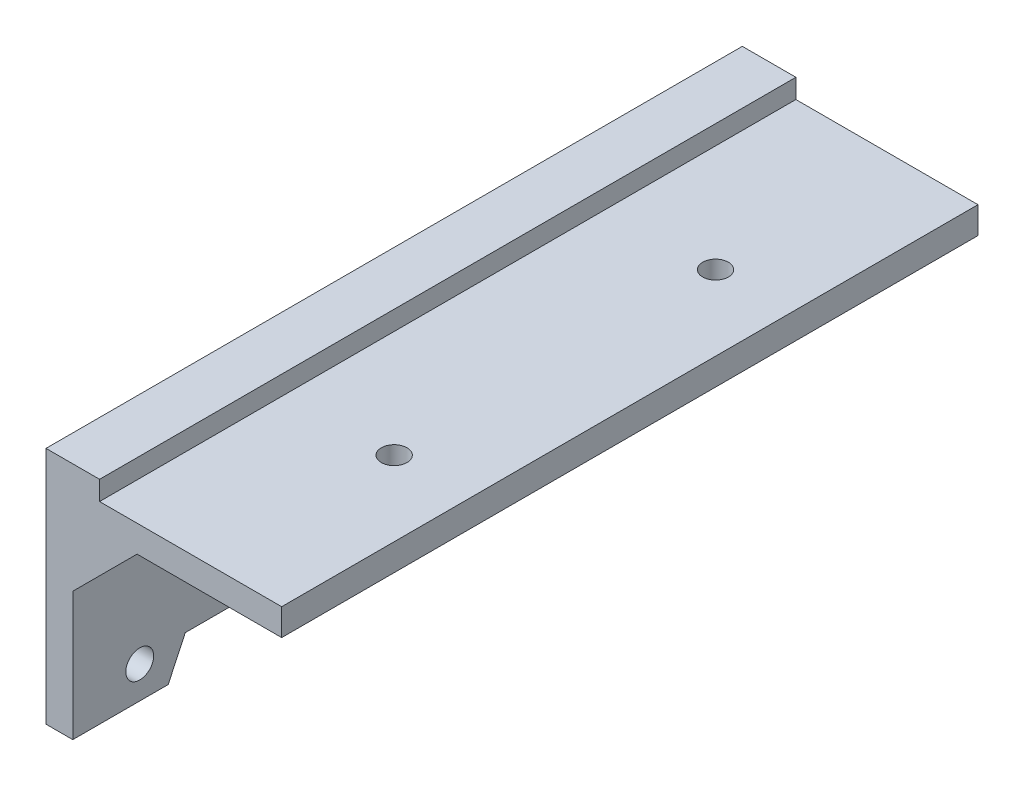
ISO-10303-21;
HEADER;
FILE_DESCRIPTION(('STEP AP214'),'2;1');
FILE_NAME('part.step','',(''),(''),'','','');
FILE_SCHEMA(('AUTOMOTIVE_DESIGN { 1 0 10303 214 1 1 1 1 }'));
ENDSEC;
DATA;
#1=APPLICATION_CONTEXT('core data for automotive mechanical design processes');
#2=APPLICATION_PROTOCOL_DEFINITION('international standard','automotive_design',2000,#1);
#3=PRODUCT_CONTEXT('',#1,'mechanical');
#4=PRODUCT('Part','Part','',(#3));
#5=PRODUCT_RELATED_PRODUCT_CATEGORY('part','',(#4));
#6=PRODUCT_DEFINITION_FORMATION('','',#4);
#7=PRODUCT_DEFINITION_CONTEXT('part definition',#1,'design');
#8=PRODUCT_DEFINITION('design','',#6,#7);
#9=PRODUCT_DEFINITION_SHAPE('','',#8);
#10=(LENGTH_UNIT() NAMED_UNIT(*) SI_UNIT(.MILLI.,.METRE.));
#11=(NAMED_UNIT(*) PLANE_ANGLE_UNIT() SI_UNIT($,.RADIAN.));
#12=(NAMED_UNIT(*) SI_UNIT($,.STERADIAN.) SOLID_ANGLE_UNIT());
#13=UNCERTAINTY_MEASURE_WITH_UNIT(LENGTH_MEASURE(1.E-05),#10,'distance_accuracy_value','');
#14=(GEOMETRIC_REPRESENTATION_CONTEXT(3) GLOBAL_UNCERTAINTY_ASSIGNED_CONTEXT((#13)) GLOBAL_UNIT_ASSIGNED_CONTEXT((#10,
#11,#12)) REPRESENTATION_CONTEXT('',''));
#15=CARTESIAN_POINT('',(0.,0.,0.));
#16=DIRECTION('',(0.,0.,1.));
#17=DIRECTION('',(1.,0.,0.));
#18=AXIS2_PLACEMENT_3D('',#15,#16,#17);
#19=CARTESIAN_POINT('',(1.5875,-13.335,-41.275));
#20=DIRECTION('',(0.,0.,1.));
#21=DIRECTION('',(1.,0.,0.));
#22=AXIS2_PLACEMENT_3D('',#19,#20,#21);
#23=PLANE('',#22);
#24=DIRECTION('',(0.,1.,0.));
#25=VECTOR('',#24,1.);
#26=CARTESIAN_POINT('',(1.5875,-13.335,-41.275));
#27=LINE('',#26,#25);
#28=CARTESIAN_POINT('',(1.5875,-9.525,-41.275));
#29=VERTEX_POINT('',#28);
#30=CARTESIAN_POINT('',(1.5875,5.715,-41.275));
#31=VERTEX_POINT('',#30);
#32=EDGE_CURVE('E45',#29,#31,#27,.T.);
#33=ORIENTED_EDGE('',*,*,#32,.F.);
#34=DIRECTION('',(-1.,0.,0.));
#35=VECTOR('',#34,1.);
#36=CARTESIAN_POINT('',(13.5228846661474,-9.525,-41.275));
#37=LINE('',#36,#35);
#38=CARTESIAN_POINT('',(-1.5875,-9.525,-41.275));
#39=VERTEX_POINT('',#38);
#40=EDGE_CURVE('E176',#29,#39,#37,.T.);
#41=ORIENTED_EDGE('',*,*,#40,.T.);
#42=DIRECTION('',(0.,1.,0.));
#43=VECTOR('',#42,1.);
#44=CARTESIAN_POINT('',(-1.5875,-13.335,-41.275));
#45=LINE('',#44,#43);
#46=CARTESIAN_POINT('',(-1.5875,18.796,-41.275));
#47=VERTEX_POINT('',#46);
#48=EDGE_CURVE('E142',#39,#47,#45,.T.);
#49=ORIENTED_EDGE('',*,*,#48,.T.);
#50=DIRECTION('',(-1.,0.,0.));
#51=VECTOR('',#50,1.);
#52=CARTESIAN_POINT('',(-1.5875,18.796,-41.275));
#53=LINE('',#52,#51);
#54=CARTESIAN_POINT('',(4.7625,18.796,-41.275));
#55=VERTEX_POINT('',#54);
#56=EDGE_CURVE('E155',#55,#47,#53,.T.);
#57=ORIENTED_EDGE('',*,*,#56,.F.);
#58=DIRECTION('',(0.,-1.,0.));
#59=VECTOR('',#58,1.);
#60=CARTESIAN_POINT('',(4.7625,18.796,-41.275));
#61=LINE('',#60,#59);
#62=CARTESIAN_POINT('',(4.7625,16.51,-41.275));
#63=VERTEX_POINT('',#62);
#64=EDGE_CURVE('E160',#55,#63,#61,.T.);
#65=ORIENTED_EDGE('',*,*,#64,.T.);
#66=DIRECTION('',(-1.,0.,0.));
#67=VECTOR('',#66,1.);
#68=CARTESIAN_POINT('',(26.3525,16.51,-41.275));
#69=LINE('',#68,#67);
#70=CARTESIAN_POINT('',(26.3525,16.51,-41.275));
#71=VERTEX_POINT('',#70);
#72=EDGE_CURVE('E244',#71,#63,#69,.T.);
#73=ORIENTED_EDGE('',*,*,#72,.F.);
#74=DIRECTION('',(0.,-1.,0.));
#75=VECTOR('',#74,1.);
#76=CARTESIAN_POINT('',(26.3525,16.51,-41.275));
#77=LINE('',#76,#75);
#78=CARTESIAN_POINT('',(26.3525,13.335,-41.275));
#79=VERTEX_POINT('',#78);
#80=EDGE_CURVE('E230',#71,#79,#77,.T.);
#81=ORIENTED_EDGE('',*,*,#80,.T.);
#82=DIRECTION('',(-1.,0.,0.));
#83=VECTOR('',#82,1.);
#84=CARTESIAN_POINT('',(26.3525,13.335,-41.275));
#85=LINE('',#84,#83);
#86=CARTESIAN_POINT('',(9.2075,13.335,-41.275));
#87=VERTEX_POINT('',#86);
#88=EDGE_CURVE('E241',#79,#87,#85,.T.);
#89=ORIENTED_EDGE('',*,*,#88,.T.);
#90=DIRECTION('',(-0.707106781186547,-0.707106781186548,0.));
#91=VECTOR('',#90,1.);
#92=CARTESIAN_POINT('',(1.5875,5.715,-41.275));
#93=LINE('',#92,#91);
#94=EDGE_CURVE('E187',#87,#31,#93,.T.);
#95=ORIENTED_EDGE('',*,*,#94,.T.);
#96=EDGE_LOOP('',(#33,#41,#49,#57,#65,#73,#81,#89,#95));
#97=FACE_BOUND('',#96,.T.);
#98=ADVANCED_FACE('F37',(#97),#23,.F.);
#99=CARTESIAN_POINT('',(1.5875,-13.335,41.275));
#100=DIRECTION('',(0.,0.,-1.));
#101=DIRECTION('',(-1.,0.,0.));
#102=AXIS2_PLACEMENT_3D('',#99,#100,#101);
#103=PLANE('',#102);
#104=DIRECTION('',(0.,-1.,0.));
#105=VECTOR('',#104,1.);
#106=CARTESIAN_POINT('',(-1.5875,-13.335,41.275));
#107=LINE('',#106,#105);
#108=CARTESIAN_POINT('',(-1.5875,18.796,41.275));
#109=VERTEX_POINT('',#108);
#110=CARTESIAN_POINT('',(-1.5875,-9.525,41.275));
#111=VERTEX_POINT('',#110);
#112=EDGE_CURVE('E40',#109,#111,#107,.T.);
#113=ORIENTED_EDGE('',*,*,#112,.T.);
#114=DIRECTION('',(-1.,0.,0.));
#115=VECTOR('',#114,1.);
#116=CARTESIAN_POINT('',(13.5228846661474,-9.525,41.275));
#117=LINE('',#116,#115);
#118=CARTESIAN_POINT('',(1.5875,-9.525,41.275));
#119=VERTEX_POINT('',#118);
#120=EDGE_CURVE('E170',#119,#111,#117,.T.);
#121=ORIENTED_EDGE('',*,*,#120,.F.);
#122=DIRECTION('',(0.,-1.,0.));
#123=VECTOR('',#122,1.);
#124=CARTESIAN_POINT('',(1.5875,-13.335,41.275));
#125=LINE('',#124,#123);
#126=CARTESIAN_POINT('',(1.5875,5.715,41.275));
#127=VERTEX_POINT('',#126);
#128=EDGE_CURVE('E11',#127,#119,#125,.T.);
#129=ORIENTED_EDGE('',*,*,#128,.F.);
#130=DIRECTION('',(0.707106781186547,0.707106781186548,0.));
#131=VECTOR('',#130,1.);
#132=CARTESIAN_POINT('',(1.5875,5.715,41.275));
#133=LINE('',#132,#131);
#134=CARTESIAN_POINT('',(9.2075,13.335,41.275));
#135=VERTEX_POINT('',#134);
#136=EDGE_CURVE('E175',#127,#135,#133,.T.);
#137=ORIENTED_EDGE('',*,*,#136,.T.);
#138=DIRECTION('',(-1.,0.,0.));
#139=VECTOR('',#138,1.);
#140=CARTESIAN_POINT('',(26.3525,13.335,41.275));
#141=LINE('',#140,#139);
#142=CARTESIAN_POINT('',(26.3525,13.335,41.275));
#143=VERTEX_POINT('',#142);
#144=EDGE_CURVE('E237',#143,#135,#141,.T.);
#145=ORIENTED_EDGE('',*,*,#144,.F.);
#146=DIRECTION('',(0.,1.,0.));
#147=VECTOR('',#146,1.);
#148=CARTESIAN_POINT('',(26.3525,16.51,41.275));
#149=LINE('',#148,#147);
#150=CARTESIAN_POINT('',(26.3525,16.51,41.275));
#151=VERTEX_POINT('',#150);
#152=EDGE_CURVE('E224',#143,#151,#149,.T.);
#153=ORIENTED_EDGE('',*,*,#152,.T.);
#154=DIRECTION('',(-1.,0.,0.));
#155=VECTOR('',#154,1.);
#156=CARTESIAN_POINT('',(26.3525,16.51,41.275));
#157=LINE('',#156,#155);
#158=CARTESIAN_POINT('',(4.76250000000001,16.51,41.275));
#159=VERTEX_POINT('',#158);
#160=EDGE_CURVE('E236',#151,#159,#157,.T.);
#161=ORIENTED_EDGE('',*,*,#160,.T.);
#162=DIRECTION('',(0.,-1.,0.));
#163=VECTOR('',#162,1.);
#164=CARTESIAN_POINT('',(4.76250000000001,18.796,41.275));
#165=LINE('',#164,#163);
#166=CARTESIAN_POINT('',(4.76250000000001,18.796,41.275));
#167=VERTEX_POINT('',#166);
#168=EDGE_CURVE('E147',#167,#159,#165,.T.);
#169=ORIENTED_EDGE('',*,*,#168,.F.);
#170=DIRECTION('',(1.,0.,0.));
#171=VECTOR('',#170,1.);
#172=CARTESIAN_POINT('',(-1.5875,18.796,41.275));
#173=LINE('',#172,#171);
#174=EDGE_CURVE('E144',#109,#167,#173,.T.);
#175=ORIENTED_EDGE('',*,*,#174,.F.);
#176=EDGE_LOOP('',(#113,#121,#129,#137,#145,#153,#161,#169,#175));
#177=FACE_BOUND('',#176,.T.);
#178=ADVANCED_FACE('F145',(#177),#103,.F.);
#179=CARTESIAN_POINT('',(1.5875,0.,0.));
#180=DIRECTION('',(-1.,0.,0.));
#181=DIRECTION('',(0.,0.,1.));
#182=AXIS2_PLACEMENT_3D('',#179,#180,#181);
#183=PLANE('',#182);
#184=ORIENTED_EDGE('',*,*,#128,.T.);
#185=DIRECTION('',(0.,0.,1.));
#186=VECTOR('',#185,1.);
#187=CARTESIAN_POINT('',(1.5875,-9.525,41.275));
#188=LINE('',#187,#186);
#189=CARTESIAN_POINT('',(1.5875,-9.525,29.9640625));
#190=VERTEX_POINT('',#189);
#191=EDGE_CURVE('E165',#190,#119,#188,.T.);
#192=ORIENTED_EDGE('',*,*,#191,.F.);
#193=DIRECTION('',(0.,-0.905458935958869,0.424433876230719));
#194=VECTOR('',#193,1.);
#195=CARTESIAN_POINT('',(1.58750000000001,-5.20699999999999,27.94));
#196=LINE('',#195,#194);
#197=CARTESIAN_POINT('',(1.58750000000001,-5.20699999999999,27.94));
#198=VERTEX_POINT('',#197);
#199=EDGE_CURVE('E195',#198,#190,#196,.T.);
#200=ORIENTED_EDGE('',*,*,#199,.F.);
#201=DIRECTION('',(0.,0.,1.));
#202=VECTOR('',#201,1.);
#203=CARTESIAN_POINT('',(1.58750000000001,-5.207,-27.94));
#204=LINE('',#203,#202);
#205=CARTESIAN_POINT('',(1.58750000000001,-5.207,-27.94));
#206=VERTEX_POINT('',#205);
#207=EDGE_CURVE('E199',#206,#198,#204,.T.);
#208=ORIENTED_EDGE('',*,*,#207,.F.);
#209=DIRECTION('',(0.,0.905458935958869,0.424433876230719));
#210=VECTOR('',#209,1.);
#211=CARTESIAN_POINT('',(1.58750000000001,-13.335,-31.75));
#212=LINE('',#211,#210);
#213=CARTESIAN_POINT('',(1.58750000000001,-9.525,-29.9640625));
#214=VERTEX_POINT('',#213);
#215=EDGE_CURVE('E193',#214,#206,#212,.T.);
#216=ORIENTED_EDGE('',*,*,#215,.F.);
#217=DIRECTION('',(0.,0.,1.));
#218=VECTOR('',#217,1.);
#219=CARTESIAN_POINT('',(1.5875,-9.525,-41.275));
#220=LINE('',#219,#218);
#221=EDGE_CURVE('E173',#29,#214,#220,.T.);
#222=ORIENTED_EDGE('',*,*,#221,.F.);
#223=ORIENTED_EDGE('',*,*,#32,.T.);
#224=DIRECTION('',(0.,0.,1.));
#225=VECTOR('',#224,1.);
#226=CARTESIAN_POINT('',(1.5875,5.715,-52.051307345283));
#227=LINE('',#226,#225);
#228=EDGE_CURVE('E184',#31,#127,#227,.T.);
#229=ORIENTED_EDGE('',*,*,#228,.T.);
#230=EDGE_LOOP('',(#184,#192,#200,#208,#216,#222,#223,#229));
#231=FACE_BOUND('',#230,.T.);
#232=CARTESIAN_POINT('',(1.5875,-5.715,-33.3375));
#233=DIRECTION('',(-1.,0.,0.));
#234=DIRECTION('',(0.,0.,1.));
#235=AXIS2_PLACEMENT_3D('',#232,#233,#234);
#236=CIRCLE('',#235,1.651);
#237=CARTESIAN_POINT('',(1.5875,-5.715,-31.6865));
#238=VERTEX_POINT('',#237);
#239=EDGE_CURVE('E249',#238,#238,#236,.F.);
#240=ORIENTED_EDGE('',*,*,#239,.F.);
#241=EDGE_LOOP('',(#240));
#242=FACE_BOUND('',#241,.T.);
#243=CARTESIAN_POINT('',(1.5875,-5.71499999999999,33.3375));
#244=DIRECTION('',(-1.,0.,0.));
#245=DIRECTION('',(0.,0.,1.));
#246=AXIS2_PLACEMENT_3D('',#243,#244,#245);
#247=CIRCLE('',#246,1.651);
#248=CARTESIAN_POINT('',(1.5875,-5.71499999999999,34.9885));
#249=VERTEX_POINT('',#248);
#250=EDGE_CURVE('E255',#249,#249,#247,.F.);
#251=ORIENTED_EDGE('',*,*,#250,.F.);
#252=EDGE_LOOP('',(#251));
#253=FACE_BOUND('',#252,.T.);
#254=ADVANCED_FACE('F279',(#231,#242,#253),#183,.F.);
#255=CARTESIAN_POINT('',(-1.5875,0.,0.));
#256=DIRECTION('',(-1.,0.,0.));
#257=DIRECTION('',(0.,0.,1.));
#258=AXIS2_PLACEMENT_3D('',#255,#256,#257);
#259=PLANE('',#258);
#260=DIRECTION('',(0.,0.,-1.));
#261=VECTOR('',#260,1.);
#262=CARTESIAN_POINT('',(-1.5875,-9.525,41.275));
#263=LINE('',#262,#261);
#264=CARTESIAN_POINT('',(-1.5875,-9.525,29.9640625));
#265=VERTEX_POINT('',#264);
#266=EDGE_CURVE('E61',#111,#265,#263,.T.);
#267=ORIENTED_EDGE('',*,*,#266,.F.);
#268=ORIENTED_EDGE('',*,*,#112,.F.);
#269=DIRECTION('',(0.,0.,1.));
#270=VECTOR('',#269,1.);
#271=CARTESIAN_POINT('',(-1.5875,18.796,-41.275));
#272=LINE('',#271,#270);
#273=EDGE_CURVE('E138',#47,#109,#272,.T.);
#274=ORIENTED_EDGE('',*,*,#273,.F.);
#275=ORIENTED_EDGE('',*,*,#48,.F.);
#276=DIRECTION('',(0.,0.,-1.));
#277=VECTOR('',#276,1.);
#278=CARTESIAN_POINT('',(-1.5875,-9.525,-41.275));
#279=LINE('',#278,#277);
#280=CARTESIAN_POINT('',(-1.5875,-9.525,-29.9640625));
#281=VERTEX_POINT('',#280);
#282=EDGE_CURVE('E167',#281,#39,#279,.T.);
#283=ORIENTED_EDGE('',*,*,#282,.F.);
#284=DIRECTION('',(0.,-0.905458935958869,-0.424433876230719));
#285=VECTOR('',#284,1.);
#286=CARTESIAN_POINT('',(-1.5875,-13.335,-31.75));
#287=LINE('',#286,#285);
#288=CARTESIAN_POINT('',(-1.5875,-5.207,-27.94));
#289=VERTEX_POINT('',#288);
#290=EDGE_CURVE('E204',#289,#281,#287,.T.);
#291=ORIENTED_EDGE('',*,*,#290,.F.);
#292=DIRECTION('',(0.,0.,-1.));
#293=VECTOR('',#292,1.);
#294=CARTESIAN_POINT('',(-1.5875,-5.207,-27.94));
#295=LINE('',#294,#293);
#296=CARTESIAN_POINT('',(-1.5875,-5.20699999999999,27.94));
#297=VERTEX_POINT('',#296);
#298=EDGE_CURVE('E201',#297,#289,#295,.T.);
#299=ORIENTED_EDGE('',*,*,#298,.F.);
#300=DIRECTION('',(0.,0.905458935958869,-0.424433876230719));
#301=VECTOR('',#300,1.);
#302=CARTESIAN_POINT('',(-1.5875,-5.20699999999999,27.94));
#303=LINE('',#302,#301);
#304=EDGE_CURVE('E192',#265,#297,#303,.T.);
#305=ORIENTED_EDGE('',*,*,#304,.F.);
#306=EDGE_LOOP('',(#267,#268,#274,#275,#283,#291,#299,#305));
#307=FACE_BOUND('',#306,.T.);
#308=CARTESIAN_POINT('',(-1.5875,-5.715,-33.3375));
#309=DIRECTION('',(-1.,0.,0.));
#310=DIRECTION('',(0.,0.,1.));
#311=AXIS2_PLACEMENT_3D('',#308,#309,#310);
#312=CIRCLE('',#311,1.651);
#313=CARTESIAN_POINT('',(-1.5875,-5.715,-31.6865));
#314=VERTEX_POINT('',#313);
#315=EDGE_CURVE('E240',#314,#314,#312,.T.);
#316=ORIENTED_EDGE('',*,*,#315,.F.);
#317=EDGE_LOOP('',(#316));
#318=FACE_BOUND('',#317,.T.);
#319=CARTESIAN_POINT('',(-1.5875,-5.71499999999999,33.3375));
#320=DIRECTION('',(-1.,0.,0.));
#321=DIRECTION('',(0.,0.,1.));
#322=AXIS2_PLACEMENT_3D('',#319,#320,#321);
#323=CIRCLE('',#322,1.651);
#324=CARTESIAN_POINT('',(-1.5875,-5.71499999999999,34.9885));
#325=VERTEX_POINT('',#324);
#326=EDGE_CURVE('E252',#325,#325,#323,.T.);
#327=ORIENTED_EDGE('',*,*,#326,.F.);
#328=EDGE_LOOP('',(#327));
#329=FACE_BOUND('',#328,.T.);
#330=ADVANCED_FACE('F134',(#307,#318,#329),#259,.T.);
#331=CARTESIAN_POINT('',(6.25723318295596,-5.71499999999999,33.3375));
#332=DIRECTION('',(-1.,0.,0.));
#333=DIRECTION('',(0.,0.,1.));
#334=AXIS2_PLACEMENT_3D('',#331,#332,#333);
#335=CYLINDRICAL_SURFACE('',#334,1.651);
#336=ORIENTED_EDGE('',*,*,#250,.T.);
#337=EDGE_LOOP('',(#336));
#338=FACE_BOUND('',#337,.T.);
#339=ORIENTED_EDGE('',*,*,#326,.T.);
#340=EDGE_LOOP('',(#339));
#341=FACE_BOUND('',#340,.T.);
#342=ADVANCED_FACE('F318',(#338,#341),#335,.F.);
#343=CARTESIAN_POINT('',(6.25723318295596,-5.715,-33.3375));
#344=DIRECTION('',(-1.,0.,0.));
#345=DIRECTION('',(0.,0.,1.));
#346=AXIS2_PLACEMENT_3D('',#343,#344,#345);
#347=CYLINDRICAL_SURFACE('',#346,1.651);
#348=ORIENTED_EDGE('',*,*,#239,.T.);
#349=EDGE_LOOP('',(#348));
#350=FACE_BOUND('',#349,.T.);
#351=ORIENTED_EDGE('',*,*,#315,.T.);
#352=EDGE_LOOP('',(#351));
#353=FACE_BOUND('',#352,.T.);
#354=ADVANCED_FACE('F313',(#350,#353),#347,.F.);
#355=CARTESIAN_POINT('',(26.3525,13.335,-41.275));
#356=DIRECTION('',(0.,-1.,0.));
#357=DIRECTION('',(0.,0.,-1.));
#358=AXIS2_PLACEMENT_3D('',#355,#356,#357);
#359=PLANE('',#358);
#360=DIRECTION('',(0.,0.,1.));
#361=VECTOR('',#360,1.);
#362=CARTESIAN_POINT('',(9.2075,13.335,-52.051307345283));
#363=LINE('',#362,#361);
#364=EDGE_CURVE('E185',#87,#135,#363,.T.);
#365=ORIENTED_EDGE('',*,*,#364,.F.);
#366=ORIENTED_EDGE('',*,*,#88,.F.);
#367=DIRECTION('',(0.,0.,1.));
#368=VECTOR('',#367,1.);
#369=CARTESIAN_POINT('',(26.3525,13.335,-41.275));
#370=LINE('',#369,#368);
#371=EDGE_CURVE('E233',#79,#143,#370,.T.);
#372=ORIENTED_EDGE('',*,*,#371,.T.);
#373=ORIENTED_EDGE('',*,*,#144,.T.);
#374=EDGE_LOOP('',(#365,#366,#372,#373));
#375=FACE_BOUND('',#374,.T.);
#376=CARTESIAN_POINT('',(17.4625,13.335,19.05));
#377=DIRECTION('',(0.,-1.,0.));
#378=DIRECTION('',(0.,0.,-1.));
#379=AXIS2_PLACEMENT_3D('',#376,#377,#378);
#380=CIRCLE('',#379,1.524);
#381=CARTESIAN_POINT('',(17.4625,13.335,17.526));
#382=VERTEX_POINT('',#381);
#383=EDGE_CURVE('E215',#382,#382,#380,.F.);
#384=ORIENTED_EDGE('',*,*,#383,.T.);
#385=EDGE_LOOP('',(#384));
#386=FACE_BOUND('',#385,.T.);
#387=CARTESIAN_POINT('',(17.4625,13.335,-19.05));
#388=DIRECTION('',(0.,-1.,0.));
#389=DIRECTION('',(0.,0.,-1.));
#390=AXIS2_PLACEMENT_3D('',#387,#388,#389);
#391=CIRCLE('',#390,1.524);
#392=CARTESIAN_POINT('',(17.4625,13.335,-20.574));
#393=VERTEX_POINT('',#392);
#394=EDGE_CURVE('E221',#393,#393,#391,.F.);
#395=ORIENTED_EDGE('',*,*,#394,.T.);
#396=EDGE_LOOP('',(#395));
#397=FACE_BOUND('',#396,.T.);
#398=ADVANCED_FACE('F287',(#375,#386,#397),#359,.T.);
#399=CARTESIAN_POINT('',(26.3525,16.51,-41.275));
#400=DIRECTION('',(0.,1.,0.));
#401=DIRECTION('',(0.,0.,1.));
#402=AXIS2_PLACEMENT_3D('',#399,#400,#401);
#403=PLANE('',#402);
#404=DIRECTION('',(0.,0.,-1.));
#405=VECTOR('',#404,1.);
#406=CARTESIAN_POINT('',(4.7625,16.51,-41.275));
#407=LINE('',#406,#405);
#408=EDGE_CURVE('E53',#159,#63,#407,.T.);
#409=ORIENTED_EDGE('',*,*,#408,.F.);
#410=ORIENTED_EDGE('',*,*,#160,.F.);
#411=DIRECTION('',(0.,0.,-1.));
#412=VECTOR('',#411,1.);
#413=CARTESIAN_POINT('',(26.3525,16.51,-41.275));
#414=LINE('',#413,#412);
#415=EDGE_CURVE('E227',#151,#71,#414,.T.);
#416=ORIENTED_EDGE('',*,*,#415,.T.);
#417=ORIENTED_EDGE('',*,*,#72,.T.);
#418=EDGE_LOOP('',(#409,#410,#416,#417));
#419=FACE_BOUND('',#418,.T.);
#420=CARTESIAN_POINT('',(17.4625,16.51,19.05));
#421=DIRECTION('',(0.,1.,0.));
#422=DIRECTION('',(0.,0.,1.));
#423=AXIS2_PLACEMENT_3D('',#420,#421,#422);
#424=CIRCLE('',#423,1.524);
#425=CARTESIAN_POINT('',(17.4625,16.51,20.574));
#426=VERTEX_POINT('',#425);
#427=EDGE_CURVE('E212',#426,#426,#424,.T.);
#428=ORIENTED_EDGE('',*,*,#427,.F.);
#429=EDGE_LOOP('',(#428));
#430=FACE_BOUND('',#429,.T.);
#431=CARTESIAN_POINT('',(17.4625,16.51,-19.05));
#432=DIRECTION('',(0.,1.,0.));
#433=DIRECTION('',(0.,0.,1.));
#434=AXIS2_PLACEMENT_3D('',#431,#432,#433);
#435=CIRCLE('',#434,1.524);
#436=CARTESIAN_POINT('',(17.4625,16.51,-17.526));
#437=VERTEX_POINT('',#436);
#438=EDGE_CURVE('E218',#437,#437,#435,.T.);
#439=ORIENTED_EDGE('',*,*,#438,.F.);
#440=EDGE_LOOP('',(#439));
#441=FACE_BOUND('',#440,.T.);
#442=ADVANCED_FACE('F297',(#419,#430,#441),#403,.T.);
#443=CARTESIAN_POINT('',(26.3525,0.,0.));
#444=DIRECTION('',(-1.,0.,0.));
#445=DIRECTION('',(0.,0.,1.));
#446=AXIS2_PLACEMENT_3D('',#443,#444,#445);
#447=PLANE('',#446);
#448=ORIENTED_EDGE('',*,*,#152,.F.);
#449=ORIENTED_EDGE('',*,*,#371,.F.);
#450=ORIENTED_EDGE('',*,*,#80,.F.);
#451=ORIENTED_EDGE('',*,*,#415,.F.);
#452=EDGE_LOOP('',(#448,#449,#450,#451));
#453=FACE_BOUND('',#452,.T.);
#454=ADVANCED_FACE('F292',(#453),#447,.F.);
#455=CARTESIAN_POINT('',(17.4625,9.0244770618868,-19.05));
#456=DIRECTION('',(0.,1.,0.));
#457=DIRECTION('',(0.,0.,1.));
#458=AXIS2_PLACEMENT_3D('',#455,#456,#457);
#459=CYLINDRICAL_SURFACE('',#458,1.524);
#460=ORIENTED_EDGE('',*,*,#438,.T.);
#461=EDGE_LOOP('',(#460));
#462=FACE_BOUND('',#461,.T.);
#463=ORIENTED_EDGE('',*,*,#394,.F.);
#464=EDGE_LOOP('',(#463));
#465=FACE_BOUND('',#464,.T.);
#466=ADVANCED_FACE('F305',(#462,#465),#459,.F.);
#467=CARTESIAN_POINT('',(17.4625,9.0244770618868,19.05));
#468=DIRECTION('',(0.,1.,0.));
#469=DIRECTION('',(0.,0.,1.));
#470=AXIS2_PLACEMENT_3D('',#467,#468,#469);
#471=CYLINDRICAL_SURFACE('',#470,1.524);
#472=ORIENTED_EDGE('',*,*,#427,.T.);
#473=EDGE_LOOP('',(#472));
#474=FACE_BOUND('',#473,.T.);
#475=ORIENTED_EDGE('',*,*,#383,.F.);
#476=EDGE_LOOP('',(#475));
#477=FACE_BOUND('',#476,.T.);
#478=ADVANCED_FACE('F308',(#474,#477),#471,.F.);
#479=CARTESIAN_POINT('',(65.6055785716035,-5.20699999999999,27.94));
#480=DIRECTION('',(0.,0.424433876230719,0.905458935958868));
#481=DIRECTION('',(0.,-0.905458935958869,0.424433876230719));
#482=AXIS2_PLACEMENT_3D('',#479,#480,#481);
#483=PLANE('',#482);
#484=ORIENTED_EDGE('',*,*,#199,.T.);
#485=DIRECTION('',(-1.,0.,0.));
#486=VECTOR('',#485,1.);
#487=CARTESIAN_POINT('',(13.5228846661474,-9.525,29.9640625));
#488=LINE('',#487,#486);
#489=EDGE_CURVE('E168',#190,#265,#488,.T.);
#490=ORIENTED_EDGE('',*,*,#489,.T.);
#491=ORIENTED_EDGE('',*,*,#304,.T.);
#492=DIRECTION('',(-1.,0.,0.));
#493=VECTOR('',#492,1.);
#494=CARTESIAN_POINT('',(65.6055785716035,-5.20699999999999,27.94));
#495=LINE('',#494,#493);
#496=EDGE_CURVE('E207',#198,#297,#495,.T.);
#497=ORIENTED_EDGE('',*,*,#496,.F.);
#498=EDGE_LOOP('',(#484,#490,#491,#497));
#499=FACE_BOUND('',#498,.T.);
#500=ADVANCED_FACE('F274',(#499),#483,.F.);
#501=CARTESIAN_POINT('',(65.6055785716035,-13.335,-31.75));
#502=DIRECTION('',(0.,0.424433876230719,-0.905458935958868));
#503=DIRECTION('',(0.,0.905458935958869,0.424433876230719));
#504=AXIS2_PLACEMENT_3D('',#501,#502,#503);
#505=PLANE('',#504);
#506=ORIENTED_EDGE('',*,*,#290,.T.);
#507=DIRECTION('',(-1.,0.,0.));
#508=VECTOR('',#507,1.);
#509=CARTESIAN_POINT('',(13.5228846661474,-9.525,-29.9640625));
#510=LINE('',#509,#508);
#511=EDGE_CURVE('E178',#214,#281,#510,.T.);
#512=ORIENTED_EDGE('',*,*,#511,.F.);
#513=ORIENTED_EDGE('',*,*,#215,.T.);
#514=DIRECTION('',(-1.,0.,0.));
#515=VECTOR('',#514,1.);
#516=CARTESIAN_POINT('',(65.6055785716035,-5.207,-27.94));
#517=LINE('',#516,#515);
#518=EDGE_CURVE('E196',#206,#289,#517,.T.);
#519=ORIENTED_EDGE('',*,*,#518,.T.);
#520=EDGE_LOOP('',(#506,#512,#513,#519));
#521=FACE_BOUND('',#520,.T.);
#522=ADVANCED_FACE('F266',(#521),#505,.F.);
#523=CARTESIAN_POINT('',(65.6055785716035,-5.207,-27.94));
#524=DIRECTION('',(0.,1.,0.));
#525=DIRECTION('',(0.,0.,1.));
#526=AXIS2_PLACEMENT_3D('',#523,#524,#525);
#527=PLANE('',#526);
#528=ORIENTED_EDGE('',*,*,#207,.T.);
#529=ORIENTED_EDGE('',*,*,#496,.T.);
#530=ORIENTED_EDGE('',*,*,#298,.T.);
#531=ORIENTED_EDGE('',*,*,#518,.F.);
#532=EDGE_LOOP('',(#528,#529,#530,#531));
#533=FACE_BOUND('',#532,.T.);
#534=ADVANCED_FACE('F271',(#533),#527,.F.);
#535=CARTESIAN_POINT('',(1.5875,5.715,-52.051307345283));
#536=DIRECTION('',(0.707106781186548,-0.707106781186547,0.));
#537=DIRECTION('',(0.707106781186547,0.707106781186548,0.));
#538=AXIS2_PLACEMENT_3D('',#535,#536,#537);
#539=PLANE('',#538);
#540=ORIENTED_EDGE('',*,*,#94,.F.);
#541=ORIENTED_EDGE('',*,*,#364,.T.);
#542=ORIENTED_EDGE('',*,*,#136,.F.);
#543=ORIENTED_EDGE('',*,*,#228,.F.);
#544=EDGE_LOOP('',(#540,#541,#542,#543));
#545=FACE_BOUND('',#544,.T.);
#546=ADVANCED_FACE('F382',(#545),#539,.T.);
#547=CARTESIAN_POINT('',(13.5228846661474,-9.525,-41.275));
#548=DIRECTION('',(0.,1.,0.));
#549=DIRECTION('',(0.,0.,1.));
#550=AXIS2_PLACEMENT_3D('',#547,#548,#549);
#551=PLANE('',#550);
#552=ORIENTED_EDGE('',*,*,#221,.T.);
#553=ORIENTED_EDGE('',*,*,#511,.T.);
#554=ORIENTED_EDGE('',*,*,#282,.T.);
#555=ORIENTED_EDGE('',*,*,#40,.F.);
#556=EDGE_LOOP('',(#552,#553,#554,#555));
#557=FACE_BOUND('',#556,.T.);
#558=ADVANCED_FACE('F400',(#557),#551,.F.);
#559=CARTESIAN_POINT('',(13.5228846661474,-9.525,41.275));
#560=DIRECTION('',(0.,1.,0.));
#561=DIRECTION('',(0.,0.,1.));
#562=AXIS2_PLACEMENT_3D('',#559,#560,#561);
#563=PLANE('',#562);
#564=ORIENTED_EDGE('',*,*,#191,.T.);
#565=ORIENTED_EDGE('',*,*,#120,.T.);
#566=ORIENTED_EDGE('',*,*,#266,.T.);
#567=ORIENTED_EDGE('',*,*,#489,.F.);
#568=EDGE_LOOP('',(#564,#565,#566,#567));
#569=FACE_BOUND('',#568,.T.);
#570=ADVANCED_FACE('F277',(#569),#563,.F.);
#571=CARTESIAN_POINT('',(4.7625,18.796,-41.275));
#572=DIRECTION('',(-1.,0.,0.));
#573=DIRECTION('',(0.,0.,1.));
#574=AXIS2_PLACEMENT_3D('',#571,#572,#573);
#575=PLANE('',#574);
#576=ORIENTED_EDGE('',*,*,#408,.T.);
#577=ORIENTED_EDGE('',*,*,#64,.F.);
#578=DIRECTION('',(0.,0.,-1.));
#579=VECTOR('',#578,1.);
#580=CARTESIAN_POINT('',(4.7625,18.796,-41.275));
#581=LINE('',#580,#579);
#582=EDGE_CURVE('E150',#167,#55,#581,.T.);
#583=ORIENTED_EDGE('',*,*,#582,.F.);
#584=ORIENTED_EDGE('',*,*,#168,.T.);
#585=EDGE_LOOP('',(#576,#577,#583,#584));
#586=FACE_BOUND('',#585,.T.);
#587=ADVANCED_FACE('F295',(#586),#575,.F.);
#588=CARTESIAN_POINT('',(0.,18.796,0.));
#589=DIRECTION('',(0.,1.,0.));
#590=DIRECTION('',(0.,0.,1.));
#591=AXIS2_PLACEMENT_3D('',#588,#589,#590);
#592=PLANE('',#591);
#593=ORIENTED_EDGE('',*,*,#273,.T.);
#594=ORIENTED_EDGE('',*,*,#174,.T.);
#595=ORIENTED_EDGE('',*,*,#582,.T.);
#596=ORIENTED_EDGE('',*,*,#56,.T.);
#597=EDGE_LOOP('',(#593,#594,#595,#596));
#598=FACE_BOUND('',#597,.T.);
#599=ADVANCED_FACE('F153',(#598),#592,.T.);
#600=CLOSED_SHELL('',(#98,#178,#254,#330,#342,#354,#398,#442,#454,#466,#478,#500,#522,#534,#546,
#558,#570,#587,#599));
#601=MANIFOLD_SOLID_BREP('B2',#600);
#602=ADVANCED_BREP_SHAPE_REPRESENTATION('',(#18,#601),#14);
#603=SHAPE_DEFINITION_REPRESENTATION(#9,#602);
ENDSEC;
END-ISO-10303-21;
